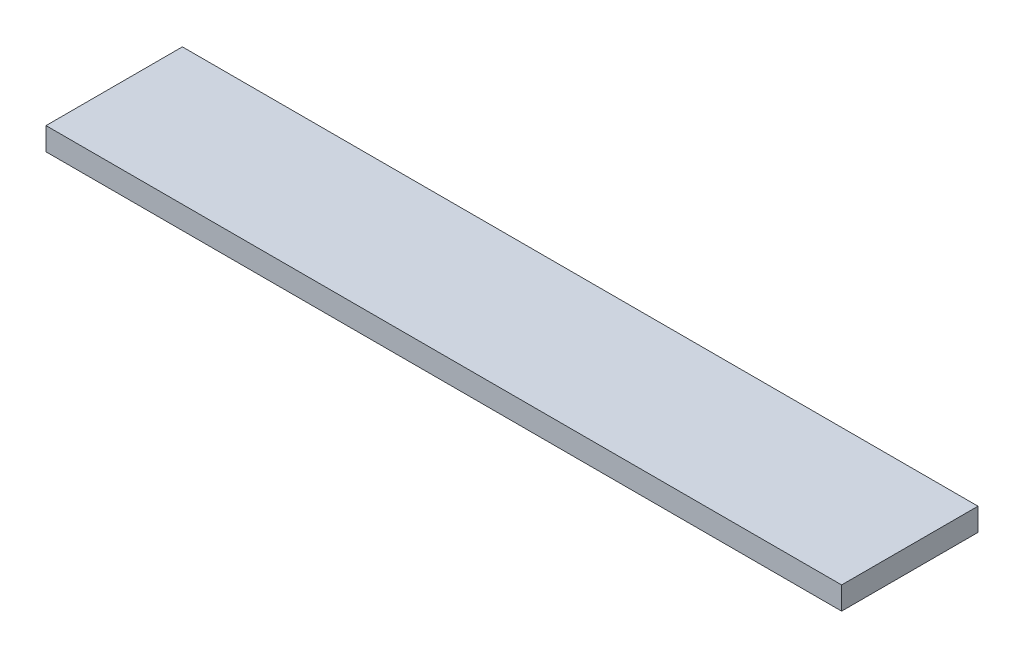
ISO-10303-21;
HEADER;
FILE_DESCRIPTION(('STEP AP214'),'2;1');
FILE_NAME('part.step','',(''),(''),'','','');
FILE_SCHEMA(('AUTOMOTIVE_DESIGN { 1 0 10303 214 1 1 1 1 }'));
ENDSEC;
DATA;
#1=APPLICATION_CONTEXT('core data for automotive mechanical design processes');
#2=APPLICATION_PROTOCOL_DEFINITION('international standard','automotive_design',2000,#1);
#3=PRODUCT_CONTEXT('',#1,'mechanical');
#4=PRODUCT('Part','Part','',(#3));
#5=PRODUCT_RELATED_PRODUCT_CATEGORY('part','',(#4));
#6=PRODUCT_DEFINITION_FORMATION('','',#4);
#7=PRODUCT_DEFINITION_CONTEXT('part definition',#1,'design');
#8=PRODUCT_DEFINITION('design','',#6,#7);
#9=PRODUCT_DEFINITION_SHAPE('','',#8);
#10=(LENGTH_UNIT() NAMED_UNIT(*) SI_UNIT(.MILLI.,.METRE.));
#11=(NAMED_UNIT(*) PLANE_ANGLE_UNIT() SI_UNIT($,.RADIAN.));
#12=(NAMED_UNIT(*) SI_UNIT($,.STERADIAN.) SOLID_ANGLE_UNIT());
#13=UNCERTAINTY_MEASURE_WITH_UNIT(LENGTH_MEASURE(1.E-05),#10,'distance_accuracy_value','');
#14=(GEOMETRIC_REPRESENTATION_CONTEXT(3) GLOBAL_UNCERTAINTY_ASSIGNED_CONTEXT((#13)) GLOBAL_UNIT_ASSIGNED_CONTEXT((#10,
#11,#12)) REPRESENTATION_CONTEXT('',''));
#15=CARTESIAN_POINT('',(0.,0.,0.));
#16=DIRECTION('',(0.,0.,1.));
#17=DIRECTION('',(1.,0.,0.));
#18=AXIS2_PLACEMENT_3D('',#15,#16,#17);
#19=CARTESIAN_POINT('',(-22.3111111111111,12.3555555555555,3.25));
#20=DIRECTION('',(1.,0.,0.));
#21=DIRECTION('',(0.,1.,0.));
#22=AXIS2_PLACEMENT_3D('',#19,#20,#21);
#23=PLANE('',#22);
#24=DIRECTION('',(0.,0.,-1.));
#25=VECTOR('',#24,1.);
#26=CARTESIAN_POINT('',(-22.3111111111111,13.3555555555555,3.25));
#27=LINE('',#26,#25);
#28=CARTESIAN_POINT('',(-22.3111111111111,13.3555555555555,3.25));
#29=VERTEX_POINT('',#28);
#30=CARTESIAN_POINT('',(-22.3111111111111,13.3555555555556,-2.75));
#31=VERTEX_POINT('',#30);
#32=EDGE_CURVE('E98',#29,#31,#27,.T.);
#33=ORIENTED_EDGE('',*,*,#32,.T.);
#34=DIRECTION('',(0.,1.,0.));
#35=VECTOR('',#34,1.);
#36=CARTESIAN_POINT('',(-22.3111111111111,12.3555555555556,-2.75));
#37=LINE('',#36,#35);
#38=CARTESIAN_POINT('',(-22.3111111111111,12.3555555555556,-2.75));
#39=VERTEX_POINT('',#38);
#40=EDGE_CURVE('E11',#39,#31,#37,.T.);
#41=ORIENTED_EDGE('',*,*,#40,.F.);
#42=DIRECTION('',(0.,0.,-1.));
#43=VECTOR('',#42,1.);
#44=CARTESIAN_POINT('',(-22.3111111111111,12.3555555555555,3.25));
#45=LINE('',#44,#43);
#46=CARTESIAN_POINT('',(-22.3111111111111,12.3555555555555,3.25));
#47=VERTEX_POINT('',#46);
#48=EDGE_CURVE('E86',#47,#39,#45,.T.);
#49=ORIENTED_EDGE('',*,*,#48,.F.);
#50=DIRECTION('',(0.,1.,0.));
#51=VECTOR('',#50,1.);
#52=CARTESIAN_POINT('',(-22.3111111111111,12.3555555555555,3.25));
#53=LINE('',#52,#51);
#54=EDGE_CURVE('E94',#47,#29,#53,.T.);
#55=ORIENTED_EDGE('',*,*,#54,.T.);
#56=EDGE_LOOP('',(#33,#41,#49,#55));
#57=FACE_BOUND('',#56,.T.);
#58=ADVANCED_FACE('F35',(#57),#23,.F.);
#59=CARTESIAN_POINT('',(-22.3111111111111,12.3555555555556,-2.75));
#60=DIRECTION('',(0.,0.,1.));
#61=DIRECTION('',(0.,-1.,0.));
#62=AXIS2_PLACEMENT_3D('',#59,#60,#61);
#63=PLANE('',#62);
#64=DIRECTION('',(1.,0.,0.));
#65=VECTOR('',#64,1.);
#66=CARTESIAN_POINT('',(-22.3111111111111,13.3555555555556,-2.75));
#67=LINE('',#66,#65);
#68=CARTESIAN_POINT('',(12.6888888888889,13.3555555555556,-2.75));
#69=VERTEX_POINT('',#68);
#70=EDGE_CURVE('E90',#31,#69,#67,.T.);
#71=ORIENTED_EDGE('',*,*,#70,.T.);
#72=DIRECTION('',(0.,1.,0.));
#73=VECTOR('',#72,1.);
#74=CARTESIAN_POINT('',(12.6888888888889,12.3555555555556,-2.75));
#75=LINE('',#74,#73);
#76=CARTESIAN_POINT('',(12.6888888888889,12.3555555555556,-2.75));
#77=VERTEX_POINT('',#76);
#78=EDGE_CURVE('E43',#77,#69,#75,.T.);
#79=ORIENTED_EDGE('',*,*,#78,.F.);
#80=DIRECTION('',(1.,0.,0.));
#81=VECTOR('',#80,1.);
#82=CARTESIAN_POINT('',(-22.3111111111111,12.3555555555556,-2.75));
#83=LINE('',#82,#81);
#84=EDGE_CURVE('E81',#39,#77,#83,.T.);
#85=ORIENTED_EDGE('',*,*,#84,.F.);
#86=ORIENTED_EDGE('',*,*,#40,.T.);
#87=EDGE_LOOP('',(#71,#79,#85,#86));
#88=FACE_BOUND('',#87,.T.);
#89=ADVANCED_FACE('F89',(#88),#63,.F.);
#90=CARTESIAN_POINT('',(12.6888888888889,12.3555555555555,3.25));
#91=DIRECTION('',(-1.,0.,0.));
#92=DIRECTION('',(0.,0.,-1.));
#93=AXIS2_PLACEMENT_3D('',#90,#91,#92);
#94=PLANE('',#93);
#95=DIRECTION('',(0.,0.,1.));
#96=VECTOR('',#95,1.);
#97=CARTESIAN_POINT('',(12.6888888888889,13.3555555555555,3.25));
#98=LINE('',#97,#96);
#99=CARTESIAN_POINT('',(12.6888888888889,13.3555555555555,3.25));
#100=VERTEX_POINT('',#99);
#101=EDGE_CURVE('E68',#69,#100,#98,.T.);
#102=ORIENTED_EDGE('',*,*,#101,.T.);
#103=DIRECTION('',(0.,1.,0.));
#104=VECTOR('',#103,1.);
#105=CARTESIAN_POINT('',(12.6888888888889,12.3555555555555,3.25));
#106=LINE('',#105,#104);
#107=CARTESIAN_POINT('',(12.6888888888889,12.3555555555555,3.25));
#108=VERTEX_POINT('',#107);
#109=EDGE_CURVE('E91',#108,#100,#106,.T.);
#110=ORIENTED_EDGE('',*,*,#109,.F.);
#111=DIRECTION('',(0.,0.,1.));
#112=VECTOR('',#111,1.);
#113=CARTESIAN_POINT('',(12.6888888888889,12.3555555555555,3.25));
#114=LINE('',#113,#112);
#115=EDGE_CURVE('E84',#77,#108,#114,.T.);
#116=ORIENTED_EDGE('',*,*,#115,.F.);
#117=ORIENTED_EDGE('',*,*,#78,.T.);
#118=EDGE_LOOP('',(#102,#110,#116,#117));
#119=FACE_BOUND('',#118,.T.);
#120=ADVANCED_FACE('F92',(#119),#94,.F.);
#121=CARTESIAN_POINT('',(-22.3111111111111,12.3555555555555,3.25));
#122=DIRECTION('',(0.,0.,-1.));
#123=DIRECTION('',(0.,1.,0.));
#124=AXIS2_PLACEMENT_3D('',#121,#122,#123);
#125=PLANE('',#124);
#126=DIRECTION('',(-1.,0.,0.));
#127=VECTOR('',#126,1.);
#128=CARTESIAN_POINT('',(-22.3111111111111,13.3555555555555,3.25));
#129=LINE('',#128,#127);
#130=EDGE_CURVE('E74',#100,#29,#129,.T.);
#131=ORIENTED_EDGE('',*,*,#130,.T.);
#132=ORIENTED_EDGE('',*,*,#54,.F.);
#133=DIRECTION('',(-1.,0.,0.));
#134=VECTOR('',#133,1.);
#135=CARTESIAN_POINT('',(-22.3111111111111,12.3555555555555,3.25));
#136=LINE('',#135,#134);
#137=EDGE_CURVE('E51',#108,#47,#136,.T.);
#138=ORIENTED_EDGE('',*,*,#137,.F.);
#139=ORIENTED_EDGE('',*,*,#109,.T.);
#140=EDGE_LOOP('',(#131,#132,#138,#139));
#141=FACE_BOUND('',#140,.T.);
#142=ADVANCED_FACE('F105',(#141),#125,.F.);
#143=CARTESIAN_POINT('',(0.,12.3555555555556,-12.8555555555556));
#144=DIRECTION('',(0.,-1.,0.));
#145=DIRECTION('',(1.,0.,0.));
#146=AXIS2_PLACEMENT_3D('',#143,#144,#145);
#147=PLANE('',#146);
#148=ORIENTED_EDGE('',*,*,#48,.T.);
#149=ORIENTED_EDGE('',*,*,#84,.T.);
#150=ORIENTED_EDGE('',*,*,#115,.T.);
#151=ORIENTED_EDGE('',*,*,#137,.T.);
#152=EDGE_LOOP('',(#148,#149,#150,#151));
#153=FACE_BOUND('',#152,.T.);
#154=ADVANCED_FACE('F82',(#153),#147,.T.);
#155=CARTESIAN_POINT('',(0.,13.3555555555556,-12.8555555555555));
#156=DIRECTION('',(0.,-1.,0.));
#157=DIRECTION('',(1.,0.,0.));
#158=AXIS2_PLACEMENT_3D('',#155,#156,#157);
#159=PLANE('',#158);
#160=ORIENTED_EDGE('',*,*,#32,.F.);
#161=ORIENTED_EDGE('',*,*,#130,.F.);
#162=ORIENTED_EDGE('',*,*,#101,.F.);
#163=ORIENTED_EDGE('',*,*,#70,.F.);
#164=EDGE_LOOP('',(#160,#161,#162,#163));
#165=FACE_BOUND('',#164,.T.);
#166=ADVANCED_FACE('F108',(#165),#159,.F.);
#167=CLOSED_SHELL('',(#58,#89,#120,#142,#154,#166));
#168=MANIFOLD_SOLID_BREP('B2',#167);
#169=ADVANCED_BREP_SHAPE_REPRESENTATION('',(#18,#168),#14);
#170=SHAPE_DEFINITION_REPRESENTATION(#9,#169);
ENDSEC;
END-ISO-10303-21;
